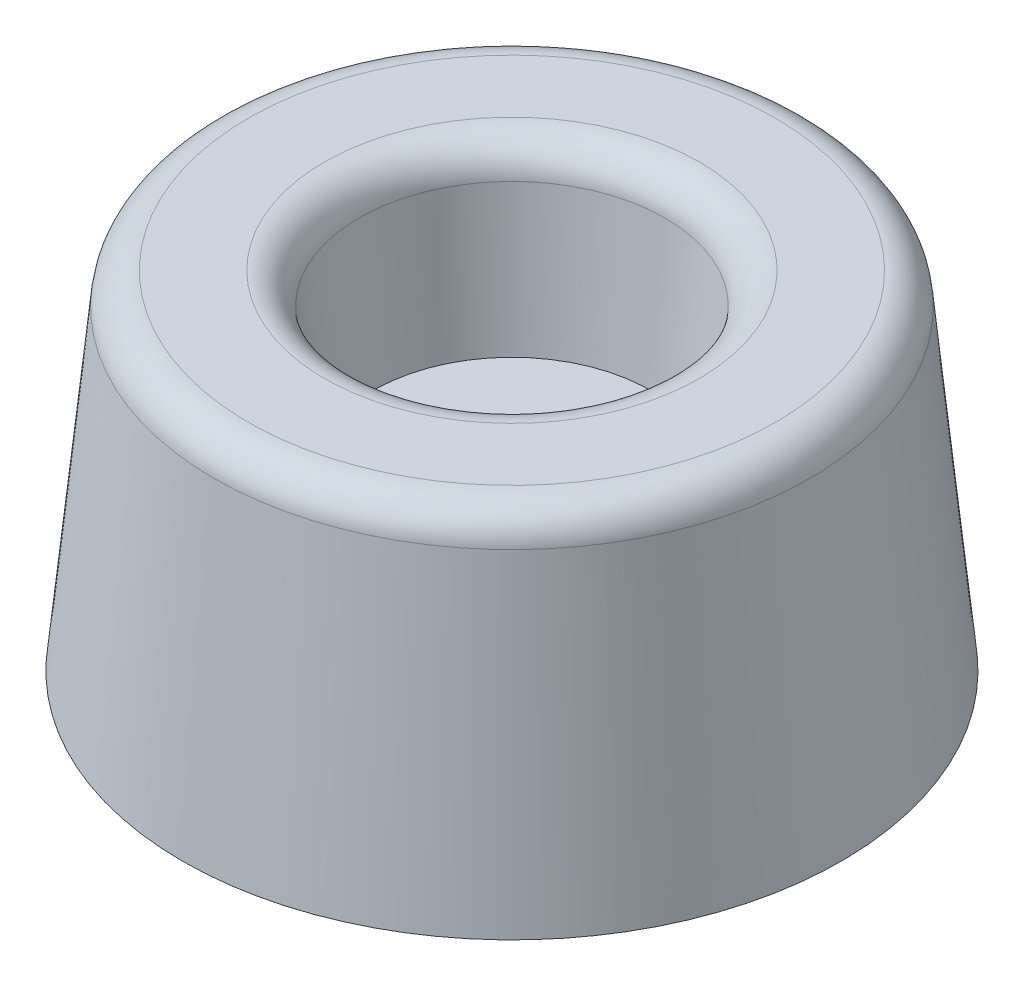
ISO-10303-21;
HEADER;
FILE_DESCRIPTION(('STEP AP214'),'2;1');
FILE_NAME('part.step','',(''),(''),'','','');
FILE_SCHEMA(('AUTOMOTIVE_DESIGN { 1 0 10303 214 1 1 1 1 }'));
ENDSEC;
DATA;
#1=APPLICATION_CONTEXT('core data for automotive mechanical design processes');
#2=APPLICATION_PROTOCOL_DEFINITION('international standard','automotive_design',2000,#1);
#3=PRODUCT_CONTEXT('',#1,'mechanical');
#4=PRODUCT('Part','Part','',(#3));
#5=PRODUCT_RELATED_PRODUCT_CATEGORY('part','',(#4));
#6=PRODUCT_DEFINITION_FORMATION('','',#4);
#7=PRODUCT_DEFINITION_CONTEXT('part definition',#1,'design');
#8=PRODUCT_DEFINITION('design','',#6,#7);
#9=PRODUCT_DEFINITION_SHAPE('','',#8);
#10=(LENGTH_UNIT() NAMED_UNIT(*) SI_UNIT(.MILLI.,.METRE.));
#11=(NAMED_UNIT(*) PLANE_ANGLE_UNIT() SI_UNIT($,.RADIAN.));
#12=(NAMED_UNIT(*) SI_UNIT($,.STERADIAN.) SOLID_ANGLE_UNIT());
#13=UNCERTAINTY_MEASURE_WITH_UNIT(LENGTH_MEASURE(1.E-05),#10,'distance_accuracy_value','');
#14=(GEOMETRIC_REPRESENTATION_CONTEXT(3) GLOBAL_UNCERTAINTY_ASSIGNED_CONTEXT((#13)) GLOBAL_UNIT_ASSIGNED_CONTEXT((#10,
#11,#12)) REPRESENTATION_CONTEXT('',''));
#15=CARTESIAN_POINT('',(0.,0.,0.));
#16=DIRECTION('',(0.,0.,1.));
#17=DIRECTION('',(1.,0.,0.));
#18=AXIS2_PLACEMENT_3D('',#15,#16,#17);
#19=CARTESIAN_POINT('',(0.,0.,0.));
#20=DIRECTION('',(0.,1.,0.));
#21=DIRECTION('',(0.,0.,1.));
#22=AXIS2_PLACEMENT_3D('',#19,#20,#21);
#23=PLANE('',#22);
#24=CARTESIAN_POINT('',(0.,0.,0.));
#25=DIRECTION('',(0.,1.,0.));
#26=DIRECTION('',(0.,0.,1.));
#27=AXIS2_PLACEMENT_3D('',#24,#25,#26);
#28=CIRCLE('',#27,9.5);
#29=CARTESIAN_POINT('',(0.,0.,9.5));
#30=VERTEX_POINT('',#29);
#31=EDGE_CURVE('E51',#30,#30,#28,.T.);
#32=ORIENTED_EDGE('',*,*,#31,.F.);
#33=EDGE_LOOP('',(#32));
#34=FACE_BOUND('',#33,.T.);
#35=ADVANCED_FACE('F31',(#34),#23,.F.);
#36=CARTESIAN_POINT('',(0.,0.,0.));
#37=DIRECTION('',(0.,-1.,0.));
#38=DIRECTION('',(0.,0.,-1.));
#39=AXIS2_PLACEMENT_3D('',#36,#37,#38);
#40=CONICAL_SURFACE('',#39,9.5,0.0996686524911617);
#41=CARTESIAN_POINT('',(0.,9.09950371902099,0.));
#42=DIRECTION('',(0.,1.,0.));
#43=DIRECTION('',(0.,0.,1.));
#44=AXIS2_PLACEMENT_3D('',#41,#42,#43);
#45=CIRCLE('',#44,8.5900496280979);
#46=CARTESIAN_POINT('',(0.,9.09950371902099,8.5900496280979));
#47=VERTEX_POINT('',#46);
#48=EDGE_CURVE('E38',#47,#47,#45,.F.);
#49=ORIENTED_EDGE('',*,*,#48,.T.);
#50=EDGE_LOOP('',(#49));
#51=FACE_BOUND('',#50,.T.);
#52=ORIENTED_EDGE('',*,*,#31,.T.);
#53=EDGE_LOOP('',(#52));
#54=FACE_BOUND('',#53,.T.);
#55=ADVANCED_FACE('F70',(#51,#54),#40,.T.);
#56=CARTESIAN_POINT('',(8.5,10.,0.));
#57=DIRECTION('',(0.,-1.,0.));
#58=DIRECTION('',(0.,0.,-1.));
#59=AXIS2_PLACEMENT_3D('',#56,#57,#58);
#60=PLANE('',#59);
#61=CARTESIAN_POINT('',(0.,10.,0.));
#62=DIRECTION('',(0.,-1.,0.));
#63=DIRECTION('',(0.,0.,-1.));
#64=AXIS2_PLACEMENT_3D('',#61,#62,#63);
#65=CIRCLE('',#64,7.59501243788791);
#66=CARTESIAN_POINT('',(0.,10.,-7.59501243788791));
#67=VERTEX_POINT('',#66);
#68=EDGE_CURVE('E42',#67,#67,#65,.F.);
#69=ORIENTED_EDGE('',*,*,#68,.T.);
#70=EDGE_LOOP('',(#69));
#71=FACE_BOUND('',#70,.T.);
#72=CARTESIAN_POINT('',(0.,10.,0.));
#73=DIRECTION('',(0.,-1.,0.));
#74=DIRECTION('',(0.,0.,-1.));
#75=AXIS2_PLACEMENT_3D('',#72,#73,#74);
#76=CIRCLE('',#75,5.40498756211209);
#77=CARTESIAN_POINT('',(0.,10.,-5.40498756211209));
#78=VERTEX_POINT('',#77);
#79=EDGE_CURVE('E46',#78,#78,#76,.T.);
#80=ORIENTED_EDGE('',*,*,#79,.T.);
#81=EDGE_LOOP('',(#80));
#82=FACE_BOUND('',#81,.T.);
#83=ADVANCED_FACE('F62',(#71,#82),#60,.F.);
#84=CARTESIAN_POINT('',(0.,10.,0.));
#85=DIRECTION('',(0.,1.,0.));
#86=DIRECTION('',(0.,0.,1.));
#87=AXIS2_PLACEMENT_3D('',#84,#85,#86);
#88=CONICAL_SURFACE('',#87,4.5,0.0996686524911617);
#89=CARTESIAN_POINT('',(0.,9.099503719021,0.));
#90=DIRECTION('',(0.,-1.,0.));
#91=DIRECTION('',(0.,0.,-1.));
#92=AXIS2_PLACEMENT_3D('',#89,#90,#91);
#93=CIRCLE('',#92,4.4099503719021);
#94=CARTESIAN_POINT('',(0.,9.099503719021,-4.4099503719021));
#95=VERTEX_POINT('',#94);
#96=EDGE_CURVE('E10',#95,#95,#93,.F.);
#97=ORIENTED_EDGE('',*,*,#96,.T.);
#98=EDGE_LOOP('',(#97));
#99=FACE_BOUND('',#98,.T.);
#100=CARTESIAN_POINT('',(0.,5.,0.));
#101=DIRECTION('',(0.,1.,0.));
#102=DIRECTION('',(0.,0.,1.));
#103=AXIS2_PLACEMENT_3D('',#100,#101,#102);
#104=CIRCLE('',#103,4.);
#105=CARTESIAN_POINT('',(0.,5.,4.));
#106=VERTEX_POINT('',#105);
#107=EDGE_CURVE('E54',#106,#106,#104,.T.);
#108=ORIENTED_EDGE('',*,*,#107,.F.);
#109=EDGE_LOOP('',(#108));
#110=FACE_BOUND('',#109,.T.);
#111=ADVANCED_FACE('F60',(#99,#110),#88,.F.);
#112=CARTESIAN_POINT('',(4.,5.,0.));
#113=DIRECTION('',(0.,-1.,0.));
#114=DIRECTION('',(0.,0.,-1.));
#115=AXIS2_PLACEMENT_3D('',#112,#113,#114);
#116=PLANE('',#115);
#117=ORIENTED_EDGE('',*,*,#107,.T.);
#118=EDGE_LOOP('',(#117));
#119=FACE_BOUND('',#118,.T.);
#120=ADVANCED_FACE('F58',(#119),#116,.F.);
#121=CARTESIAN_POINT('',(0.,9.,0.));
#122=DIRECTION('',(0.,-1.,0.));
#123=DIRECTION('',(0.,0.,-1.));
#124=AXIS2_PLACEMENT_3D('',#121,#122,#123);
#125=TOROIDAL_SURFACE('',#124,7.59501243788791,1.);
#126=ORIENTED_EDGE('',*,*,#48,.F.);
#127=EDGE_LOOP('',(#126));
#128=FACE_BOUND('',#127,.T.);
#129=ORIENTED_EDGE('',*,*,#68,.F.);
#130=EDGE_LOOP('',(#129));
#131=FACE_BOUND('',#130,.T.);
#132=ADVANCED_FACE('F68',(#128,#131),#125,.T.);
#133=CARTESIAN_POINT('',(0.,9.,0.));
#134=DIRECTION('',(0.,-1.,0.));
#135=DIRECTION('',(0.,0.,-1.));
#136=AXIS2_PLACEMENT_3D('',#133,#134,#135);
#137=TOROIDAL_SURFACE('',#136,5.40498756211209,1.);
#138=ORIENTED_EDGE('',*,*,#79,.F.);
#139=EDGE_LOOP('',(#138));
#140=FACE_BOUND('',#139,.T.);
#141=ORIENTED_EDGE('',*,*,#96,.F.);
#142=EDGE_LOOP('',(#141));
#143=FACE_BOUND('',#142,.T.);
#144=ADVANCED_FACE('F33',(#140,#143),#137,.T.);
#145=CLOSED_SHELL('',(#35,#55,#83,#111,#120,#132,#144));
#146=MANIFOLD_SOLID_BREP('B2',#145);
#147=ADVANCED_BREP_SHAPE_REPRESENTATION('',(#18,#146),#14);
#148=SHAPE_DEFINITION_REPRESENTATION(#9,#147);
ENDSEC;
END-ISO-10303-21;
